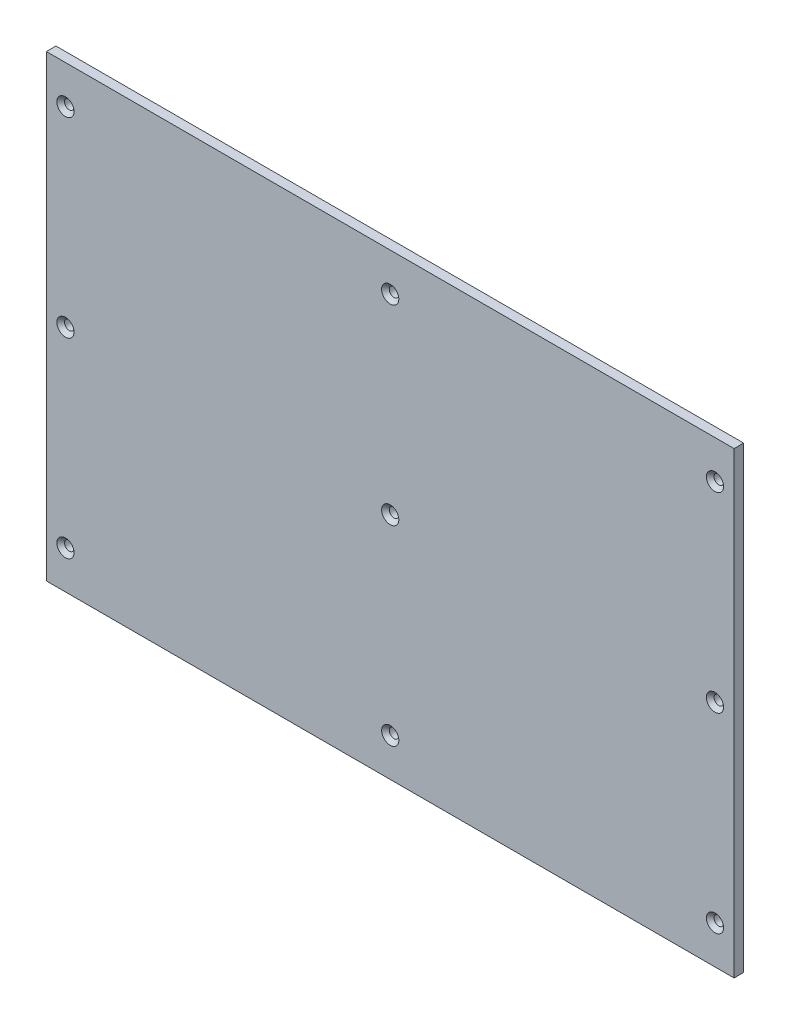
ISO-10303-21;
HEADER;
FILE_DESCRIPTION(('STEP AP214'),'2;1');
FILE_NAME('part.step','',(''),(''),'','','');
FILE_SCHEMA(('AUTOMOTIVE_DESIGN { 1 0 10303 214 1 1 1 1 }'));
ENDSEC;
DATA;
#1=APPLICATION_CONTEXT('core data for automotive mechanical design processes');
#2=APPLICATION_PROTOCOL_DEFINITION('international standard','automotive_design',2000,#1);
#3=PRODUCT_CONTEXT('',#1,'mechanical');
#4=PRODUCT('Part','Part','',(#3));
#5=PRODUCT_RELATED_PRODUCT_CATEGORY('part','',(#4));
#6=PRODUCT_DEFINITION_FORMATION('','',#4);
#7=PRODUCT_DEFINITION_CONTEXT('part definition',#1,'design');
#8=PRODUCT_DEFINITION('design','',#6,#7);
#9=PRODUCT_DEFINITION_SHAPE('','',#8);
#10=(LENGTH_UNIT() NAMED_UNIT(*) SI_UNIT(.MILLI.,.METRE.));
#11=(NAMED_UNIT(*) PLANE_ANGLE_UNIT() SI_UNIT($,.RADIAN.));
#12=(NAMED_UNIT(*) SI_UNIT($,.STERADIAN.) SOLID_ANGLE_UNIT());
#13=UNCERTAINTY_MEASURE_WITH_UNIT(LENGTH_MEASURE(1.E-05),#10,'distance_accuracy_value','');
#14=(GEOMETRIC_REPRESENTATION_CONTEXT(3) GLOBAL_UNCERTAINTY_ASSIGNED_CONTEXT((#13)) GLOBAL_UNIT_ASSIGNED_CONTEXT((#10,
#11,#12)) REPRESENTATION_CONTEXT('',''));
#15=CARTESIAN_POINT('',(0.,0.,0.));
#16=DIRECTION('',(0.,0.,1.));
#17=DIRECTION('',(1.,0.,0.));
#18=AXIS2_PLACEMENT_3D('',#15,#16,#17);
#19=CARTESIAN_POINT('',(180.,-120.,5.00000000000335));
#20=DIRECTION('',(-1.,0.,0.));
#21=DIRECTION('',(0.,0.,1.));
#22=AXIS2_PLACEMENT_3D('',#19,#20,#21);
#23=PLANE('',#22);
#24=DIRECTION('',(0.,1.,0.));
#25=VECTOR('',#24,1.);
#26=CARTESIAN_POINT('',(180.,-120.,3.3584246494911E-12));
#27=LINE('',#26,#25);
#28=CARTESIAN_POINT('',(180.,-120.,3.3584246494911E-12));
#29=VERTEX_POINT('',#28);
#30=CARTESIAN_POINT('',(180.,120.,3.3584246494911E-12));
#31=VERTEX_POINT('',#30);
#32=EDGE_CURVE('E124',#29,#31,#27,.T.);
#33=ORIENTED_EDGE('',*,*,#32,.T.);
#34=DIRECTION('',(0.,0.,-1.));
#35=VECTOR('',#34,1.);
#36=CARTESIAN_POINT('',(180.,120.,5.00000000000335));
#37=LINE('',#36,#35);
#38=CARTESIAN_POINT('',(180.,120.,5.00000000000335));
#39=VERTEX_POINT('',#38);
#40=EDGE_CURVE('E112',#39,#31,#37,.T.);
#41=ORIENTED_EDGE('',*,*,#40,.F.);
#42=DIRECTION('',(0.,1.,0.));
#43=VECTOR('',#42,1.);
#44=CARTESIAN_POINT('',(180.,-120.,5.00000000000335));
#45=LINE('',#44,#43);
#46=CARTESIAN_POINT('',(180.,-120.,5.00000000000335));
#47=VERTEX_POINT('',#46);
#48=EDGE_CURVE('E104',#47,#39,#45,.T.);
#49=ORIENTED_EDGE('',*,*,#48,.F.);
#50=DIRECTION('',(0.,0.,-1.));
#51=VECTOR('',#50,1.);
#52=CARTESIAN_POINT('',(180.,-120.,5.00000000000335));
#53=LINE('',#52,#51);
#54=EDGE_CURVE('E120',#47,#29,#53,.T.);
#55=ORIENTED_EDGE('',*,*,#54,.T.);
#56=EDGE_LOOP('',(#33,#41,#49,#55));
#57=FACE_BOUND('',#56,.T.);
#58=ADVANCED_FACE('F49',(#57),#23,.F.);
#59=CARTESIAN_POINT('',(-180.,120.,4.99999999999606));
#60=DIRECTION('',(0.,-1.,0.));
#61=DIRECTION('',(0.,0.,-1.));
#62=AXIS2_PLACEMENT_3D('',#59,#60,#61);
#63=PLANE('',#62);
#64=DIRECTION('',(-1.,0.,0.));
#65=VECTOR('',#64,1.);
#66=CARTESIAN_POINT('',(-180.,120.,-3.94129173741931E-12));
#67=LINE('',#66,#65);
#68=CARTESIAN_POINT('',(-180.,120.,-3.94129173741931E-12));
#69=VERTEX_POINT('',#68);
#70=EDGE_CURVE('E110',#31,#69,#67,.T.);
#71=ORIENTED_EDGE('',*,*,#70,.T.);
#72=DIRECTION('',(0.,0.,-1.));
#73=VECTOR('',#72,1.);
#74=CARTESIAN_POINT('',(-180.,120.,4.99999999999606));
#75=LINE('',#74,#73);
#76=CARTESIAN_POINT('',(-180.,120.,4.99999999999606));
#77=VERTEX_POINT('',#76);
#78=EDGE_CURVE('E108',#77,#69,#75,.T.);
#79=ORIENTED_EDGE('',*,*,#78,.F.);
#80=DIRECTION('',(-1.,0.,0.));
#81=VECTOR('',#80,1.);
#82=CARTESIAN_POINT('',(-180.,120.,4.99999999999606));
#83=LINE('',#82,#81);
#84=EDGE_CURVE('E99',#39,#77,#83,.T.);
#85=ORIENTED_EDGE('',*,*,#84,.F.);
#86=ORIENTED_EDGE('',*,*,#40,.T.);
#87=EDGE_LOOP('',(#71,#79,#85,#86));
#88=FACE_BOUND('',#87,.T.);
#89=ADVANCED_FACE('F109',(#88),#63,.F.);
#90=CARTESIAN_POINT('',(-180.,-120.,4.99999999999606));
#91=DIRECTION('',(1.,0.,0.));
#92=DIRECTION('',(0.,0.,-1.));
#93=AXIS2_PLACEMENT_3D('',#90,#91,#92);
#94=PLANE('',#93);
#95=DIRECTION('',(0.,-1.,0.));
#96=VECTOR('',#95,1.);
#97=CARTESIAN_POINT('',(-180.,-120.,-3.94129173741931E-12));
#98=LINE('',#97,#96);
#99=CARTESIAN_POINT('',(-180.,-120.,-3.94129173741931E-12));
#100=VERTEX_POINT('',#99);
#101=EDGE_CURVE('E85',#69,#100,#98,.T.);
#102=ORIENTED_EDGE('',*,*,#101,.T.);
#103=DIRECTION('',(0.,0.,-1.));
#104=VECTOR('',#103,1.);
#105=CARTESIAN_POINT('',(-180.,-120.,4.99999999999606));
#106=LINE('',#105,#104);
#107=CARTESIAN_POINT('',(-180.,-120.,4.99999999999606));
#108=VERTEX_POINT('',#107);
#109=EDGE_CURVE('E113',#108,#100,#106,.T.);
#110=ORIENTED_EDGE('',*,*,#109,.F.);
#111=DIRECTION('',(0.,-1.,0.));
#112=VECTOR('',#111,1.);
#113=CARTESIAN_POINT('',(-180.,-120.,4.99999999999606));
#114=LINE('',#113,#112);
#115=EDGE_CURVE('E102',#77,#108,#114,.T.);
#116=ORIENTED_EDGE('',*,*,#115,.F.);
#117=ORIENTED_EDGE('',*,*,#78,.T.);
#118=EDGE_LOOP('',(#102,#110,#116,#117));
#119=FACE_BOUND('',#118,.T.);
#120=ADVANCED_FACE('F115',(#119),#94,.F.);
#121=CARTESIAN_POINT('',(-180.,-120.,4.99999999999606));
#122=DIRECTION('',(0.,1.,0.));
#123=DIRECTION('',(0.,0.,1.));
#124=AXIS2_PLACEMENT_3D('',#121,#122,#123);
#125=PLANE('',#124);
#126=DIRECTION('',(1.,0.,0.));
#127=VECTOR('',#126,1.);
#128=CARTESIAN_POINT('',(-180.,-120.,-3.94129173741931E-12));
#129=LINE('',#128,#127);
#130=EDGE_CURVE('E91',#100,#29,#129,.T.);
#131=ORIENTED_EDGE('',*,*,#130,.T.);
#132=ORIENTED_EDGE('',*,*,#54,.F.);
#133=DIRECTION('',(1.,0.,0.));
#134=VECTOR('',#133,1.);
#135=CARTESIAN_POINT('',(-180.,-120.,4.99999999999606));
#136=LINE('',#135,#134);
#137=EDGE_CURVE('E68',#108,#47,#136,.T.);
#138=ORIENTED_EDGE('',*,*,#137,.F.);
#139=ORIENTED_EDGE('',*,*,#109,.T.);
#140=EDGE_LOOP('',(#131,#132,#138,#139));
#141=FACE_BOUND('',#140,.T.);
#142=ADVANCED_FACE('F368',(#141),#125,.F.);
#143=CARTESIAN_POINT('',(1.00423142024297E-13,0.,5.));
#144=DIRECTION('',(0.,0.,-1.));
#145=DIRECTION('',(-1.,0.,0.));
#146=AXIS2_PLACEMENT_3D('',#143,#144,#145);
#147=PLANE('',#146);
#148=CARTESIAN_POINT('',(170.,-100.,5.00000000000287));
#149=DIRECTION('',(0.,0.,-1.));
#150=DIRECTION('',(-1.,0.,0.));
#151=AXIS2_PLACEMENT_3D('',#148,#149,#150);
#152=CIRCLE('',#151,4.5);
#153=CARTESIAN_POINT('',(165.5,-100.,5.00000000000279));
#154=VERTEX_POINT('',#153);
#155=EDGE_CURVE('E177',#154,#154,#152,.T.);
#156=ORIENTED_EDGE('',*,*,#155,.T.);
#157=EDGE_LOOP('',(#156));
#158=FACE_BOUND('',#157,.T.);
#159=CARTESIAN_POINT('',(170.,0.,5.00000000000287));
#160=DIRECTION('',(0.,0.,-1.));
#161=DIRECTION('',(-1.,0.,0.));
#162=AXIS2_PLACEMENT_3D('',#159,#160,#161);
#163=CIRCLE('',#162,4.5);
#164=CARTESIAN_POINT('',(165.5,0.,5.00000000000279));
#165=VERTEX_POINT('',#164);
#166=EDGE_CURVE('E173',#165,#165,#163,.T.);
#167=ORIENTED_EDGE('',*,*,#166,.T.);
#168=EDGE_LOOP('',(#167));
#169=FACE_BOUND('',#168,.T.);
#170=CARTESIAN_POINT('',(170.,100.,5.00000000000287));
#171=DIRECTION('',(0.,0.,-1.));
#172=DIRECTION('',(-1.,0.,0.));
#173=AXIS2_PLACEMENT_3D('',#170,#171,#172);
#174=CIRCLE('',#173,4.5);
#175=CARTESIAN_POINT('',(165.5,100.,5.00000000000279));
#176=VERTEX_POINT('',#175);
#177=EDGE_CURVE('E169',#176,#176,#174,.T.);
#178=ORIENTED_EDGE('',*,*,#177,.T.);
#179=EDGE_LOOP('',(#178));
#180=FACE_BOUND('',#179,.T.);
#181=CARTESIAN_POINT('',(1.00423142024297E-13,100.,5.));
#182=DIRECTION('',(0.,0.,-1.));
#183=DIRECTION('',(-1.,0.,0.));
#184=AXIS2_PLACEMENT_3D('',#181,#182,#183);
#185=CIRCLE('',#184,4.5);
#186=CARTESIAN_POINT('',(-4.4999999999999,100.,4.99999999999992));
#187=VERTEX_POINT('',#186);
#188=EDGE_CURVE('E165',#187,#187,#185,.T.);
#189=ORIENTED_EDGE('',*,*,#188,.T.);
#190=EDGE_LOOP('',(#189));
#191=FACE_BOUND('',#190,.T.);
#192=CARTESIAN_POINT('',(1.00423142024297E-13,0.,5.));
#193=DIRECTION('',(0.,0.,-1.));
#194=DIRECTION('',(-1.,0.,0.));
#195=AXIS2_PLACEMENT_3D('',#192,#193,#194);
#196=CIRCLE('',#195,4.5);
#197=CARTESIAN_POINT('',(-4.4999999999999,0.,4.99999999999992));
#198=VERTEX_POINT('',#197);
#199=EDGE_CURVE('E161',#198,#198,#196,.T.);
#200=ORIENTED_EDGE('',*,*,#199,.T.);
#201=EDGE_LOOP('',(#200));
#202=FACE_BOUND('',#201,.T.);
#203=CARTESIAN_POINT('',(1.00423142024297E-13,-100.,5.));
#204=DIRECTION('',(0.,0.,-1.));
#205=DIRECTION('',(-1.,0.,0.));
#206=AXIS2_PLACEMENT_3D('',#203,#204,#205);
#207=CIRCLE('',#206,4.5);
#208=CARTESIAN_POINT('',(-4.4999999999999,-100.,4.99999999999992));
#209=VERTEX_POINT('',#208);
#210=EDGE_CURVE('E157',#209,#209,#207,.T.);
#211=ORIENTED_EDGE('',*,*,#210,.T.);
#212=EDGE_LOOP('',(#211));
#213=FACE_BOUND('',#212,.T.);
#214=CARTESIAN_POINT('',(-170.,-100.,4.99999999999669));
#215=DIRECTION('',(0.,0.,-1.));
#216=DIRECTION('',(-1.,0.,0.));
#217=AXIS2_PLACEMENT_3D('',#214,#215,#216);
#218=CIRCLE('',#217,4.5);
#219=CARTESIAN_POINT('',(-174.5,-100.,4.99999999999661));
#220=VERTEX_POINT('',#219);
#221=EDGE_CURVE('E153',#220,#220,#218,.T.);
#222=ORIENTED_EDGE('',*,*,#221,.T.);
#223=EDGE_LOOP('',(#222));
#224=FACE_BOUND('',#223,.T.);
#225=CARTESIAN_POINT('',(-170.,0.,4.99999999999669));
#226=DIRECTION('',(0.,0.,-1.));
#227=DIRECTION('',(-1.,0.,0.));
#228=AXIS2_PLACEMENT_3D('',#225,#226,#227);
#229=CIRCLE('',#228,4.5);
#230=CARTESIAN_POINT('',(-174.5,0.,4.99999999999661));
#231=VERTEX_POINT('',#230);
#232=EDGE_CURVE('E149',#231,#231,#229,.T.);
#233=ORIENTED_EDGE('',*,*,#232,.T.);
#234=EDGE_LOOP('',(#233));
#235=FACE_BOUND('',#234,.T.);
#236=CARTESIAN_POINT('',(-170.,100.,4.99999999999669));
#237=DIRECTION('',(0.,0.,-1.));
#238=DIRECTION('',(-1.,0.,0.));
#239=AXIS2_PLACEMENT_3D('',#236,#237,#238);
#240=CIRCLE('',#239,4.5);
#241=CARTESIAN_POINT('',(-174.5,100.,4.99999999999661));
#242=VERTEX_POINT('',#241);
#243=EDGE_CURVE('E145',#242,#242,#240,.T.);
#244=ORIENTED_EDGE('',*,*,#243,.T.);
#245=EDGE_LOOP('',(#244));
#246=FACE_BOUND('',#245,.T.);
#247=ORIENTED_EDGE('',*,*,#48,.T.);
#248=ORIENTED_EDGE('',*,*,#84,.T.);
#249=ORIENTED_EDGE('',*,*,#115,.T.);
#250=ORIENTED_EDGE('',*,*,#137,.T.);
#251=EDGE_LOOP('',(#247,#248,#249,#250));
#252=FACE_BOUND('',#251,.T.);
#253=ADVANCED_FACE('F100',(#158,#169,#180,#191,#202,#213,#224,#235,#246,#252),#147,.F.);
#254=CARTESIAN_POINT('',(0.,0.,0.));
#255=DIRECTION('',(0.,0.,-1.));
#256=DIRECTION('',(-1.,0.,0.));
#257=AXIS2_PLACEMENT_3D('',#254,#255,#256);
#258=PLANE('',#257);
#259=CARTESIAN_POINT('',(-170.,0.,-3.30985239216375E-12));
#260=DIRECTION('',(0.,0.,1.));
#261=DIRECTION('',(1.,0.,0.));
#262=AXIS2_PLACEMENT_3D('',#259,#260,#261);
#263=CIRCLE('',#262,2.5);
#264=CARTESIAN_POINT('',(-167.5,0.,-3.26266791361718E-12));
#265=VERTEX_POINT('',#264);
#266=EDGE_CURVE('E322',#265,#265,#263,.T.);
#267=ORIENTED_EDGE('',*,*,#266,.T.);
#268=EDGE_LOOP('',(#267));
#269=FACE_BOUND('',#268,.T.);
#270=CARTESIAN_POINT('',(-170.,-100.,-3.30985239216375E-12));
#271=DIRECTION('',(0.,0.,1.));
#272=DIRECTION('',(1.,0.,0.));
#273=AXIS2_PLACEMENT_3D('',#270,#271,#272);
#274=CIRCLE('',#273,2.5);
#275=CARTESIAN_POINT('',(-167.5,-100.,-3.26266791361718E-12));
#276=VERTEX_POINT('',#275);
#277=EDGE_CURVE('E326',#276,#276,#274,.T.);
#278=ORIENTED_EDGE('',*,*,#277,.T.);
#279=EDGE_LOOP('',(#278));
#280=FACE_BOUND('',#279,.T.);
#281=CARTESIAN_POINT('',(0.,100.,0.));
#282=DIRECTION('',(0.,0.,1.));
#283=DIRECTION('',(1.,0.,0.));
#284=AXIS2_PLACEMENT_3D('',#281,#282,#283);
#285=CIRCLE('',#284,2.5);
#286=CARTESIAN_POINT('',(2.5,100.,0.));
#287=VERTEX_POINT('',#286);
#288=EDGE_CURVE('E309',#287,#287,#285,.T.);
#289=ORIENTED_EDGE('',*,*,#288,.T.);
#290=EDGE_LOOP('',(#289));
#291=FACE_BOUND('',#290,.T.);
#292=CARTESIAN_POINT('',(0.,0.,0.));
#293=DIRECTION('',(0.,0.,1.));
#294=DIRECTION('',(1.,0.,0.));
#295=AXIS2_PLACEMENT_3D('',#292,#293,#294);
#296=CIRCLE('',#295,2.5);
#297=CARTESIAN_POINT('',(2.5,0.,0.));
#298=VERTEX_POINT('',#297);
#299=EDGE_CURVE('E302',#298,#298,#296,.T.);
#300=ORIENTED_EDGE('',*,*,#299,.T.);
#301=EDGE_LOOP('',(#300));
#302=FACE_BOUND('',#301,.T.);
#303=CARTESIAN_POINT('',(0.,-100.,0.));
#304=DIRECTION('',(0.,0.,1.));
#305=DIRECTION('',(1.,0.,0.));
#306=AXIS2_PLACEMENT_3D('',#303,#304,#305);
#307=CIRCLE('',#306,2.5);
#308=CARTESIAN_POINT('',(2.5,-100.,0.));
#309=VERTEX_POINT('',#308);
#310=EDGE_CURVE('E299',#309,#309,#307,.T.);
#311=ORIENTED_EDGE('',*,*,#310,.T.);
#312=EDGE_LOOP('',(#311));
#313=FACE_BOUND('',#312,.T.);
#314=CARTESIAN_POINT('',(170.,-100.,2.76861866765898E-12));
#315=DIRECTION('',(0.,0.,1.));
#316=DIRECTION('',(1.,0.,0.));
#317=AXIS2_PLACEMENT_3D('',#314,#315,#316);
#318=CIRCLE('',#317,2.5);
#319=CARTESIAN_POINT('',(172.5,-100.,2.81580314620555E-12));
#320=VERTEX_POINT('',#319);
#321=EDGE_CURVE('E303',#320,#320,#318,.T.);
#322=ORIENTED_EDGE('',*,*,#321,.T.);
#323=EDGE_LOOP('',(#322));
#324=FACE_BOUND('',#323,.T.);
#325=CARTESIAN_POINT('',(170.,0.,2.76861866765898E-12));
#326=DIRECTION('',(0.,0.,1.));
#327=DIRECTION('',(1.,0.,0.));
#328=AXIS2_PLACEMENT_3D('',#325,#326,#327);
#329=CIRCLE('',#328,2.5);
#330=CARTESIAN_POINT('',(172.5,0.,2.81580314620555E-12));
#331=VERTEX_POINT('',#330);
#332=EDGE_CURVE('E312',#331,#331,#329,.T.);
#333=ORIENTED_EDGE('',*,*,#332,.T.);
#334=EDGE_LOOP('',(#333));
#335=FACE_BOUND('',#334,.T.);
#336=CARTESIAN_POINT('',(170.,100.,2.76861866765898E-12));
#337=DIRECTION('',(0.,0.,1.));
#338=DIRECTION('',(1.,0.,0.));
#339=AXIS2_PLACEMENT_3D('',#336,#337,#338);
#340=CIRCLE('',#339,2.5);
#341=CARTESIAN_POINT('',(172.5,100.,2.81580314620555E-12));
#342=VERTEX_POINT('',#341);
#343=EDGE_CURVE('E318',#342,#342,#340,.T.);
#344=ORIENTED_EDGE('',*,*,#343,.T.);
#345=EDGE_LOOP('',(#344));
#346=FACE_BOUND('',#345,.T.);
#347=CARTESIAN_POINT('',(-170.,100.,-3.30985239216375E-12));
#348=DIRECTION('',(0.,0.,1.));
#349=DIRECTION('',(1.,0.,0.));
#350=AXIS2_PLACEMENT_3D('',#347,#348,#349);
#351=CIRCLE('',#350,2.5);
#352=CARTESIAN_POINT('',(-167.5,100.,-3.26266791361718E-12));
#353=VERTEX_POINT('',#352);
#354=EDGE_CURVE('E128',#353,#353,#351,.T.);
#355=ORIENTED_EDGE('',*,*,#354,.T.);
#356=EDGE_LOOP('',(#355));
#357=FACE_BOUND('',#356,.T.);
#358=ORIENTED_EDGE('',*,*,#32,.F.);
#359=ORIENTED_EDGE('',*,*,#130,.F.);
#360=ORIENTED_EDGE('',*,*,#101,.F.);
#361=ORIENTED_EDGE('',*,*,#70,.F.);
#362=EDGE_LOOP('',(#358,#359,#360,#361));
#363=FACE_BOUND('',#362,.T.);
#364=ADVANCED_FACE('F346',(#269,#280,#291,#302,#313,#324,#335,#346,#357,#363),#258,.T.);
#365=CARTESIAN_POINT('',(-170.,100.,-3.30985239216375E-12));
#366=DIRECTION('',(0.,0.,1.));
#367=DIRECTION('',(1.,0.,0.));
#368=AXIS2_PLACEMENT_3D('',#365,#366,#367);
#369=CYLINDRICAL_SURFACE('',#368,2.5);
#370=CARTESIAN_POINT('',(-170.,100.,2.99999999999675));
#371=DIRECTION('',(0.,0.,-1.));
#372=DIRECTION('',(-1.,0.,0.));
#373=AXIS2_PLACEMENT_3D('',#370,#371,#372);
#374=CIRCLE('',#373,2.5);
#375=CARTESIAN_POINT('',(-172.5,100.,2.9999999999967));
#376=VERTEX_POINT('',#375);
#377=EDGE_CURVE('E11',#376,#376,#374,.F.);
#378=ORIENTED_EDGE('',*,*,#377,.T.);
#379=EDGE_LOOP('',(#378));
#380=FACE_BOUND('',#379,.T.);
#381=ORIENTED_EDGE('',*,*,#354,.F.);
#382=EDGE_LOOP('',(#381));
#383=FACE_BOUND('',#382,.T.);
#384=ADVANCED_FACE('F349',(#380,#383),#369,.F.);
#385=CARTESIAN_POINT('',(170.,100.,2.76861866765898E-12));
#386=DIRECTION('',(0.,0.,1.));
#387=DIRECTION('',(1.,0.,0.));
#388=AXIS2_PLACEMENT_3D('',#385,#386,#387);
#389=CYLINDRICAL_SURFACE('',#388,2.5);
#390=CARTESIAN_POINT('',(170.,100.,3.00000000000277));
#391=DIRECTION('',(0.,0.,-1.));
#392=DIRECTION('',(-1.,0.,0.));
#393=AXIS2_PLACEMENT_3D('',#390,#391,#392);
#394=CIRCLE('',#393,2.5);
#395=CARTESIAN_POINT('',(167.5,100.,3.00000000000272));
#396=VERTEX_POINT('',#395);
#397=EDGE_CURVE('E185',#396,#396,#394,.F.);
#398=ORIENTED_EDGE('',*,*,#397,.T.);
#399=EDGE_LOOP('',(#398));
#400=FACE_BOUND('',#399,.T.);
#401=ORIENTED_EDGE('',*,*,#343,.F.);
#402=EDGE_LOOP('',(#401));
#403=FACE_BOUND('',#402,.T.);
#404=ADVANCED_FACE('F351',(#400,#403),#389,.F.);
#405=CARTESIAN_POINT('',(170.,0.,2.76861866765898E-12));
#406=DIRECTION('',(0.,0.,1.));
#407=DIRECTION('',(1.,0.,0.));
#408=AXIS2_PLACEMENT_3D('',#405,#406,#407);
#409=CYLINDRICAL_SURFACE('',#408,2.5);
#410=CARTESIAN_POINT('',(170.,0.,3.00000000000277));
#411=DIRECTION('',(0.,0.,-1.));
#412=DIRECTION('',(-1.,0.,0.));
#413=AXIS2_PLACEMENT_3D('',#410,#411,#412);
#414=CIRCLE('',#413,2.5);
#415=CARTESIAN_POINT('',(167.5,0.,3.00000000000272));
#416=VERTEX_POINT('',#415);
#417=EDGE_CURVE('E181',#416,#416,#414,.F.);
#418=ORIENTED_EDGE('',*,*,#417,.T.);
#419=EDGE_LOOP('',(#418));
#420=FACE_BOUND('',#419,.T.);
#421=ORIENTED_EDGE('',*,*,#332,.F.);
#422=EDGE_LOOP('',(#421));
#423=FACE_BOUND('',#422,.T.);
#424=ADVANCED_FACE('F359',(#420,#423),#409,.F.);
#425=CARTESIAN_POINT('',(170.,-100.,2.76861866765898E-12));
#426=DIRECTION('',(0.,0.,1.));
#427=DIRECTION('',(1.,0.,0.));
#428=AXIS2_PLACEMENT_3D('',#425,#426,#427);
#429=CYLINDRICAL_SURFACE('',#428,2.5);
#430=CARTESIAN_POINT('',(170.,-100.,3.00000000000277));
#431=DIRECTION('',(0.,0.,-1.));
#432=DIRECTION('',(-1.,0.,0.));
#433=AXIS2_PLACEMENT_3D('',#430,#431,#432);
#434=CIRCLE('',#433,2.5);
#435=CARTESIAN_POINT('',(167.5,-100.,3.00000000000272));
#436=VERTEX_POINT('',#435);
#437=EDGE_CURVE('E141',#436,#436,#434,.F.);
#438=ORIENTED_EDGE('',*,*,#437,.T.);
#439=EDGE_LOOP('',(#438));
#440=FACE_BOUND('',#439,.T.);
#441=ORIENTED_EDGE('',*,*,#321,.F.);
#442=EDGE_LOOP('',(#441));
#443=FACE_BOUND('',#442,.T.);
#444=ADVANCED_FACE('F295',(#440,#443),#429,.F.);
#445=CARTESIAN_POINT('',(0.,-100.,0.));
#446=DIRECTION('',(0.,0.,1.));
#447=DIRECTION('',(1.,0.,0.));
#448=AXIS2_PLACEMENT_3D('',#445,#446,#447);
#449=CYLINDRICAL_SURFACE('',#448,2.5);
#450=CARTESIAN_POINT('',(0.,-100.,3.00000000000006));
#451=DIRECTION('',(0.,0.,-1.));
#452=DIRECTION('',(-1.,0.,0.));
#453=AXIS2_PLACEMENT_3D('',#450,#451,#452);
#454=CIRCLE('',#453,2.5);
#455=CARTESIAN_POINT('',(-2.49999999999996,-100.,3.00000000000001));
#456=VERTEX_POINT('',#455);
#457=EDGE_CURVE('E197',#456,#456,#454,.F.);
#458=ORIENTED_EDGE('',*,*,#457,.T.);
#459=EDGE_LOOP('',(#458));
#460=FACE_BOUND('',#459,.T.);
#461=ORIENTED_EDGE('',*,*,#310,.F.);
#462=EDGE_LOOP('',(#461));
#463=FACE_BOUND('',#462,.T.);
#464=ADVANCED_FACE('F291',(#460,#463),#449,.F.);
#465=CARTESIAN_POINT('',(0.,0.,0.));
#466=DIRECTION('',(0.,0.,1.));
#467=DIRECTION('',(1.,0.,0.));
#468=AXIS2_PLACEMENT_3D('',#465,#466,#467);
#469=CYLINDRICAL_SURFACE('',#468,2.5);
#470=CARTESIAN_POINT('',(0.,0.,3.00000000000003));
#471=DIRECTION('',(0.,0.,-1.));
#472=DIRECTION('',(-1.,0.,0.));
#473=AXIS2_PLACEMENT_3D('',#470,#471,#472);
#474=CIRCLE('',#473,2.5);
#475=CARTESIAN_POINT('',(-2.49999999999995,0.,2.99999999999998));
#476=VERTEX_POINT('',#475);
#477=EDGE_CURVE('E193',#476,#476,#474,.F.);
#478=ORIENTED_EDGE('',*,*,#477,.T.);
#479=EDGE_LOOP('',(#478));
#480=FACE_BOUND('',#479,.T.);
#481=ORIENTED_EDGE('',*,*,#299,.F.);
#482=EDGE_LOOP('',(#481));
#483=FACE_BOUND('',#482,.T.);
#484=ADVANCED_FACE('F294',(#480,#483),#469,.F.);
#485=CARTESIAN_POINT('',(0.,100.,0.));
#486=DIRECTION('',(0.,0.,1.));
#487=DIRECTION('',(1.,0.,0.));
#488=AXIS2_PLACEMENT_3D('',#485,#486,#487);
#489=CYLINDRICAL_SURFACE('',#488,2.5);
#490=CARTESIAN_POINT('',(0.,100.,3.00000000000006));
#491=DIRECTION('',(0.,0.,-1.));
#492=DIRECTION('',(-1.,0.,0.));
#493=AXIS2_PLACEMENT_3D('',#490,#491,#492);
#494=CIRCLE('',#493,2.5);
#495=CARTESIAN_POINT('',(-2.49999999999996,100.,3.00000000000001));
#496=VERTEX_POINT('',#495);
#497=EDGE_CURVE('E189',#496,#496,#494,.F.);
#498=ORIENTED_EDGE('',*,*,#497,.T.);
#499=EDGE_LOOP('',(#498));
#500=FACE_BOUND('',#499,.T.);
#501=ORIENTED_EDGE('',*,*,#288,.F.);
#502=EDGE_LOOP('',(#501));
#503=FACE_BOUND('',#502,.T.);
#504=ADVANCED_FACE('F419',(#500,#503),#489,.F.);
#505=CARTESIAN_POINT('',(-170.,-100.,-3.30985239216375E-12));
#506=DIRECTION('',(0.,0.,1.));
#507=DIRECTION('',(1.,0.,0.));
#508=AXIS2_PLACEMENT_3D('',#505,#506,#507);
#509=CYLINDRICAL_SURFACE('',#508,2.5);
#510=CARTESIAN_POINT('',(-170.,-100.,2.99999999999675));
#511=DIRECTION('',(0.,0.,-1.));
#512=DIRECTION('',(-1.,0.,0.));
#513=AXIS2_PLACEMENT_3D('',#510,#511,#512);
#514=CIRCLE('',#513,2.5);
#515=CARTESIAN_POINT('',(-172.5,-100.,2.9999999999967));
#516=VERTEX_POINT('',#515);
#517=EDGE_CURVE('E201',#516,#516,#514,.F.);
#518=ORIENTED_EDGE('',*,*,#517,.T.);
#519=EDGE_LOOP('',(#518));
#520=FACE_BOUND('',#519,.T.);
#521=ORIENTED_EDGE('',*,*,#277,.F.);
#522=EDGE_LOOP('',(#521));
#523=FACE_BOUND('',#522,.T.);
#524=ADVANCED_FACE('F426',(#520,#523),#509,.F.);
#525=CARTESIAN_POINT('',(-170.,0.,-3.30985239216375E-12));
#526=DIRECTION('',(0.,0.,1.));
#527=DIRECTION('',(1.,0.,0.));
#528=AXIS2_PLACEMENT_3D('',#525,#526,#527);
#529=CYLINDRICAL_SURFACE('',#528,2.5);
#530=CARTESIAN_POINT('',(-170.,0.,2.99999999999675));
#531=DIRECTION('',(0.,0.,-1.));
#532=DIRECTION('',(-1.,0.,0.));
#533=AXIS2_PLACEMENT_3D('',#530,#531,#532);
#534=CIRCLE('',#533,2.5);
#535=CARTESIAN_POINT('',(-172.5,0.,2.9999999999967));
#536=VERTEX_POINT('',#535);
#537=EDGE_CURVE('E60',#536,#536,#534,.F.);
#538=ORIENTED_EDGE('',*,*,#537,.T.);
#539=EDGE_LOOP('',(#538));
#540=FACE_BOUND('',#539,.T.);
#541=ORIENTED_EDGE('',*,*,#266,.F.);
#542=EDGE_LOOP('',(#541));
#543=FACE_BOUND('',#542,.T.);
#544=ADVANCED_FACE('F209',(#540,#543),#529,.F.);
#545=CARTESIAN_POINT('',(170.,-100.,3.00000000000277));
#546=DIRECTION('',(0.,0.,1.));
#547=DIRECTION('',(1.,0.,0.));
#548=AXIS2_PLACEMENT_3D('',#545,#546,#547);
#549=CONICAL_SURFACE('',#548,2.5,0.78539816339746);
#550=ORIENTED_EDGE('',*,*,#155,.F.);
#551=EDGE_LOOP('',(#550));
#552=FACE_BOUND('',#551,.T.);
#553=ORIENTED_EDGE('',*,*,#437,.F.);
#554=EDGE_LOOP('',(#553));
#555=FACE_BOUND('',#554,.T.);
#556=ADVANCED_FACE('F238',(#552,#555),#549,.F.);
#557=CARTESIAN_POINT('',(170.,0.,3.00000000000277));
#558=DIRECTION('',(0.,0.,1.));
#559=DIRECTION('',(1.,0.,0.));
#560=AXIS2_PLACEMENT_3D('',#557,#558,#559);
#561=CONICAL_SURFACE('',#560,2.5,0.78539816339746);
#562=ORIENTED_EDGE('',*,*,#166,.F.);
#563=EDGE_LOOP('',(#562));
#564=FACE_BOUND('',#563,.T.);
#565=ORIENTED_EDGE('',*,*,#417,.F.);
#566=EDGE_LOOP('',(#565));
#567=FACE_BOUND('',#566,.T.);
#568=ADVANCED_FACE('F244',(#564,#567),#561,.F.);
#569=CARTESIAN_POINT('',(170.,100.,3.00000000000277));
#570=DIRECTION('',(0.,0.,1.));
#571=DIRECTION('',(1.,0.,0.));
#572=AXIS2_PLACEMENT_3D('',#569,#570,#571);
#573=CONICAL_SURFACE('',#572,2.5,0.78539816339746);
#574=ORIENTED_EDGE('',*,*,#177,.F.);
#575=EDGE_LOOP('',(#574));
#576=FACE_BOUND('',#575,.T.);
#577=ORIENTED_EDGE('',*,*,#397,.F.);
#578=EDGE_LOOP('',(#577));
#579=FACE_BOUND('',#578,.T.);
#580=ADVANCED_FACE('F251',(#576,#579),#573,.F.);
#581=CARTESIAN_POINT('',(0.,100.,3.00000000000006));
#582=DIRECTION('',(0.,0.,1.));
#583=DIRECTION('',(1.,0.,0.));
#584=AXIS2_PLACEMENT_3D('',#581,#582,#583);
#585=CONICAL_SURFACE('',#584,2.5,0.78539816339746);
#586=ORIENTED_EDGE('',*,*,#188,.F.);
#587=EDGE_LOOP('',(#586));
#588=FACE_BOUND('',#587,.T.);
#589=ORIENTED_EDGE('',*,*,#497,.F.);
#590=EDGE_LOOP('',(#589));
#591=FACE_BOUND('',#590,.T.);
#592=ADVANCED_FACE('F258',(#588,#591),#585,.F.);
#593=CARTESIAN_POINT('',(0.,0.,3.00000000000003));
#594=DIRECTION('',(0.,0.,1.));
#595=DIRECTION('',(1.,0.,0.));
#596=AXIS2_PLACEMENT_3D('',#593,#594,#595);
#597=CONICAL_SURFACE('',#596,2.5,0.78539816339746);
#598=ORIENTED_EDGE('',*,*,#199,.F.);
#599=EDGE_LOOP('',(#598));
#600=FACE_BOUND('',#599,.T.);
#601=ORIENTED_EDGE('',*,*,#477,.F.);
#602=EDGE_LOOP('',(#601));
#603=FACE_BOUND('',#602,.T.);
#604=ADVANCED_FACE('F265',(#600,#603),#597,.F.);
#605=CARTESIAN_POINT('',(0.,-100.,3.00000000000006));
#606=DIRECTION('',(0.,0.,1.));
#607=DIRECTION('',(1.,0.,0.));
#608=AXIS2_PLACEMENT_3D('',#605,#606,#607);
#609=CONICAL_SURFACE('',#608,2.5,0.78539816339746);
#610=ORIENTED_EDGE('',*,*,#210,.F.);
#611=EDGE_LOOP('',(#610));
#612=FACE_BOUND('',#611,.T.);
#613=ORIENTED_EDGE('',*,*,#457,.F.);
#614=EDGE_LOOP('',(#613));
#615=FACE_BOUND('',#614,.T.);
#616=ADVANCED_FACE('F222',(#612,#615),#609,.F.);
#617=CARTESIAN_POINT('',(-170.,-100.,2.99999999999675));
#618=DIRECTION('',(0.,0.,1.));
#619=DIRECTION('',(1.,0.,0.));
#620=AXIS2_PLACEMENT_3D('',#617,#618,#619);
#621=CONICAL_SURFACE('',#620,2.5,0.78539816339746);
#622=ORIENTED_EDGE('',*,*,#221,.F.);
#623=EDGE_LOOP('',(#622));
#624=FACE_BOUND('',#623,.T.);
#625=ORIENTED_EDGE('',*,*,#517,.F.);
#626=EDGE_LOOP('',(#625));
#627=FACE_BOUND('',#626,.T.);
#628=ADVANCED_FACE('F214',(#624,#627),#621,.F.);
#629=CARTESIAN_POINT('',(-170.,0.,2.99999999999675));
#630=DIRECTION('',(0.,0.,1.));
#631=DIRECTION('',(1.,0.,0.));
#632=AXIS2_PLACEMENT_3D('',#629,#630,#631);
#633=CONICAL_SURFACE('',#632,2.5,0.78539816339746);
#634=ORIENTED_EDGE('',*,*,#232,.F.);
#635=EDGE_LOOP('',(#634));
#636=FACE_BOUND('',#635,.T.);
#637=ORIENTED_EDGE('',*,*,#537,.F.);
#638=EDGE_LOOP('',(#637));
#639=FACE_BOUND('',#638,.T.);
#640=ADVANCED_FACE('F212',(#636,#639),#633,.F.);
#641=CARTESIAN_POINT('',(-170.,100.,2.99999999999675));
#642=DIRECTION('',(0.,0.,1.));
#643=DIRECTION('',(1.,0.,0.));
#644=AXIS2_PLACEMENT_3D('',#641,#642,#643);
#645=CONICAL_SURFACE('',#644,2.5,0.78539816339746);
#646=ORIENTED_EDGE('',*,*,#243,.F.);
#647=EDGE_LOOP('',(#646));
#648=FACE_BOUND('',#647,.T.);
#649=ORIENTED_EDGE('',*,*,#377,.F.);
#650=EDGE_LOOP('',(#649));
#651=FACE_BOUND('',#650,.T.);
#652=ADVANCED_FACE('F52',(#648,#651),#645,.F.);
#653=CLOSED_SHELL('',(#58,#89,#120,#142,#253,#364,#384,#404,#424,#444,#464,#484,#504,#524,#544,
#556,#568,#580,#592,#604,#616,#628,#640,#652));
#654=MANIFOLD_SOLID_BREP('B2',#653);
#655=ADVANCED_BREP_SHAPE_REPRESENTATION('',(#18,#654),#14);
#656=SHAPE_DEFINITION_REPRESENTATION(#9,#655);
ENDSEC;
END-ISO-10303-21;
